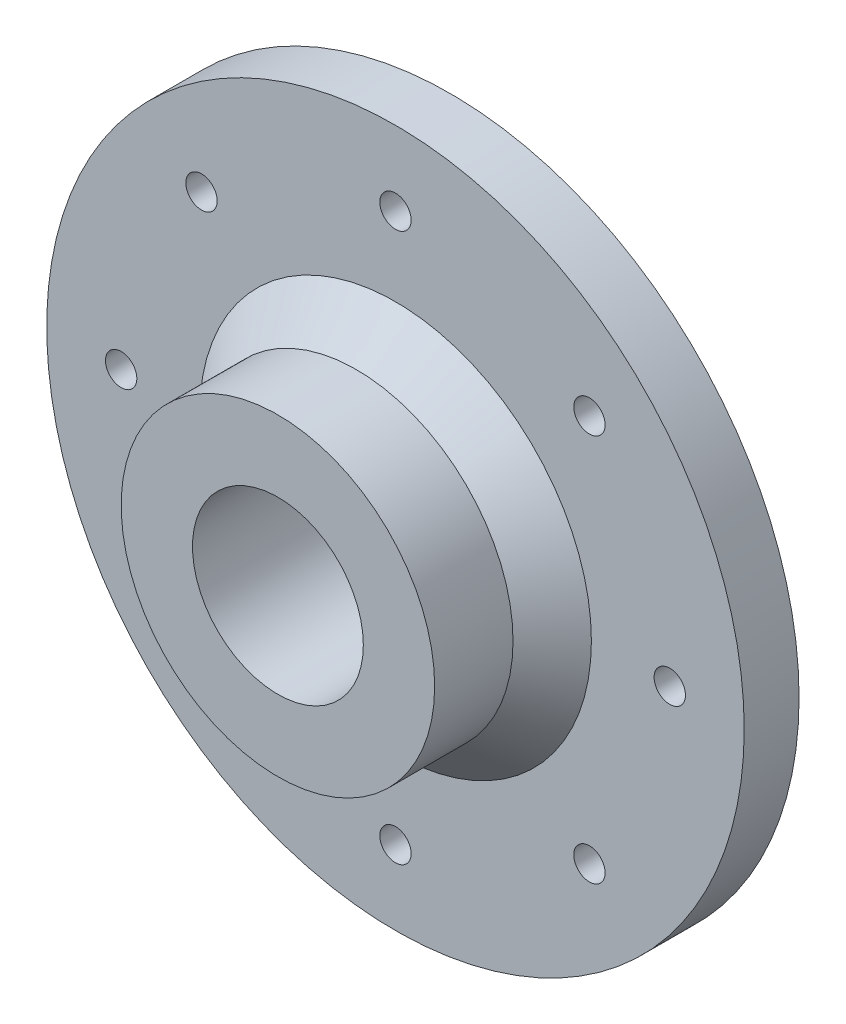
ISO-10303-21;
HEADER;
FILE_DESCRIPTION(('STEP AP214'),'2;1');
FILE_NAME('part.step','',(''),(''),'','','');
FILE_SCHEMA(('AUTOMOTIVE_DESIGN { 1 0 10303 214 1 1 1 1 }'));
ENDSEC;
DATA;
#1=APPLICATION_CONTEXT('core data for automotive mechanical design processes');
#2=APPLICATION_PROTOCOL_DEFINITION('international standard','automotive_design',2000,#1);
#3=PRODUCT_CONTEXT('',#1,'mechanical');
#4=PRODUCT('Part','Part','',(#3));
#5=PRODUCT_RELATED_PRODUCT_CATEGORY('part','',(#4));
#6=PRODUCT_DEFINITION_FORMATION('','',#4);
#7=PRODUCT_DEFINITION_CONTEXT('part definition',#1,'design');
#8=PRODUCT_DEFINITION('design','',#6,#7);
#9=PRODUCT_DEFINITION_SHAPE('','',#8);
#10=(LENGTH_UNIT() NAMED_UNIT(*) SI_UNIT(.MILLI.,.METRE.));
#11=(NAMED_UNIT(*) PLANE_ANGLE_UNIT() SI_UNIT($,.RADIAN.));
#12=(NAMED_UNIT(*) SI_UNIT($,.STERADIAN.) SOLID_ANGLE_UNIT());
#13=UNCERTAINTY_MEASURE_WITH_UNIT(LENGTH_MEASURE(1.E-05),#10,'distance_accuracy_value','');
#14=(GEOMETRIC_REPRESENTATION_CONTEXT(3) GLOBAL_UNCERTAINTY_ASSIGNED_CONTEXT((#13)) GLOBAL_UNIT_ASSIGNED_CONTEXT((#10,
#11,#12)) REPRESENTATION_CONTEXT('',''));
#15=CARTESIAN_POINT('',(0.,0.,0.));
#16=DIRECTION('',(0.,0.,1.));
#17=DIRECTION('',(1.,0.,0.));
#18=AXIS2_PLACEMENT_3D('',#15,#16,#17);
#19=CARTESIAN_POINT('',(0.,0.,7.));
#20=DIRECTION('',(0.,0.,1.));
#21=DIRECTION('',(1.,0.,0.));
#22=AXIS2_PLACEMENT_3D('',#19,#20,#21);
#23=PLANE('',#22);
#24=CARTESIAN_POINT('',(0.,0.,7.));
#25=DIRECTION('',(0.,0.,1.));
#26=DIRECTION('',(1.,0.,0.));
#27=AXIS2_PLACEMENT_3D('',#24,#25,#26);
#28=CIRCLE('',#27,25.);
#29=CARTESIAN_POINT('',(25.,0.,7.));
#30=VERTEX_POINT('',#29);
#31=EDGE_CURVE('E10',#30,#30,#28,.F.);
#32=ORIENTED_EDGE('',*,*,#31,.T.);
#33=EDGE_LOOP('',(#32));
#34=FACE_BOUND('',#33,.T.);
#35=CARTESIAN_POINT('',(-24.7487373415292,24.7487373415292,7.));
#36=DIRECTION('',(0.,0.,1.));
#37=DIRECTION('',(1.,0.,0.));
#38=AXIS2_PLACEMENT_3D('',#35,#36,#37);
#39=CIRCLE('',#38,2.);
#40=CARTESIAN_POINT('',(-22.7487373415292,24.7487373415292,7.));
#41=VERTEX_POINT('',#40);
#42=EDGE_CURVE('E102',#41,#41,#39,.T.);
#43=ORIENTED_EDGE('',*,*,#42,.F.);
#44=EDGE_LOOP('',(#43));
#45=FACE_BOUND('',#44,.T.);
#46=CARTESIAN_POINT('',(-35.,0.,7.));
#47=DIRECTION('',(0.,0.,1.));
#48=DIRECTION('',(1.,0.,0.));
#49=AXIS2_PLACEMENT_3D('',#46,#47,#48);
#50=CIRCLE('',#49,2.);
#51=CARTESIAN_POINT('',(-33.,0.,7.));
#52=VERTEX_POINT('',#51);
#53=EDGE_CURVE('E96',#52,#52,#50,.T.);
#54=ORIENTED_EDGE('',*,*,#53,.F.);
#55=EDGE_LOOP('',(#54));
#56=FACE_BOUND('',#55,.T.);
#57=CARTESIAN_POINT('',(-24.7487373415292,-24.7487373415292,7.));
#58=DIRECTION('',(0.,0.,1.));
#59=DIRECTION('',(1.,0.,0.));
#60=AXIS2_PLACEMENT_3D('',#57,#58,#59);
#61=CIRCLE('',#60,2.00000000000001);
#62=CARTESIAN_POINT('',(-22.7487373415292,-24.7487373415292,7.));
#63=VERTEX_POINT('',#62);
#64=EDGE_CURVE('E90',#63,#63,#61,.T.);
#65=ORIENTED_EDGE('',*,*,#64,.F.);
#66=EDGE_LOOP('',(#65));
#67=FACE_BOUND('',#66,.T.);
#68=CARTESIAN_POINT('',(0.,-35.,7.));
#69=DIRECTION('',(0.,0.,1.));
#70=DIRECTION('',(1.,0.,0.));
#71=AXIS2_PLACEMENT_3D('',#68,#69,#70);
#72=CIRCLE('',#71,2.);
#73=CARTESIAN_POINT('',(2.00000000000001,-35.,7.));
#74=VERTEX_POINT('',#73);
#75=EDGE_CURVE('E84',#74,#74,#72,.T.);
#76=ORIENTED_EDGE('',*,*,#75,.F.);
#77=EDGE_LOOP('',(#76));
#78=FACE_BOUND('',#77,.T.);
#79=CARTESIAN_POINT('',(24.7487373415292,-24.7487373415292,7.));
#80=DIRECTION('',(0.,0.,1.));
#81=DIRECTION('',(1.,0.,0.));
#82=AXIS2_PLACEMENT_3D('',#79,#80,#81);
#83=CIRCLE('',#82,2.);
#84=CARTESIAN_POINT('',(26.7487373415292,-24.7487373415292,7.));
#85=VERTEX_POINT('',#84);
#86=EDGE_CURVE('E78',#85,#85,#83,.T.);
#87=ORIENTED_EDGE('',*,*,#86,.F.);
#88=EDGE_LOOP('',(#87));
#89=FACE_BOUND('',#88,.T.);
#90=CARTESIAN_POINT('',(35.,0.,7.));
#91=DIRECTION('',(0.,0.,1.));
#92=DIRECTION('',(1.,0.,0.));
#93=AXIS2_PLACEMENT_3D('',#90,#91,#92);
#94=CIRCLE('',#93,2.);
#95=CARTESIAN_POINT('',(37.,0.,7.));
#96=VERTEX_POINT('',#95);
#97=EDGE_CURVE('E72',#96,#96,#94,.T.);
#98=ORIENTED_EDGE('',*,*,#97,.F.);
#99=EDGE_LOOP('',(#98));
#100=FACE_BOUND('',#99,.T.);
#101=CARTESIAN_POINT('',(24.7487373415292,24.7487373415292,7.));
#102=DIRECTION('',(0.,0.,1.));
#103=DIRECTION('',(1.,0.,0.));
#104=AXIS2_PLACEMENT_3D('',#101,#102,#103);
#105=CIRCLE('',#104,2.);
#106=CARTESIAN_POINT('',(26.7487373415292,24.7487373415292,7.));
#107=VERTEX_POINT('',#106);
#108=EDGE_CURVE('E66',#107,#107,#105,.T.);
#109=ORIENTED_EDGE('',*,*,#108,.F.);
#110=EDGE_LOOP('',(#109));
#111=FACE_BOUND('',#110,.T.);
#112=CARTESIAN_POINT('',(0.,35.,7.));
#113=DIRECTION('',(0.,0.,1.));
#114=DIRECTION('',(1.,0.,0.));
#115=AXIS2_PLACEMENT_3D('',#112,#113,#114);
#116=CIRCLE('',#115,2.);
#117=CARTESIAN_POINT('',(2.,35.,7.));
#118=VERTEX_POINT('',#117);
#119=EDGE_CURVE('E60',#118,#118,#116,.T.);
#120=ORIENTED_EDGE('',*,*,#119,.F.);
#121=EDGE_LOOP('',(#120));
#122=FACE_BOUND('',#121,.T.);
#123=CARTESIAN_POINT('',(0.,0.,7.));
#124=DIRECTION('',(0.,0.,1.));
#125=DIRECTION('',(1.,0.,0.));
#126=AXIS2_PLACEMENT_3D('',#123,#124,#125);
#127=CIRCLE('',#126,44.5);
#128=CARTESIAN_POINT('',(44.5,0.,7.));
#129=VERTEX_POINT('',#128);
#130=EDGE_CURVE('E41',#129,#129,#127,.T.);
#131=ORIENTED_EDGE('',*,*,#130,.T.);
#132=EDGE_LOOP('',(#131));
#133=FACE_BOUND('',#132,.T.);
#134=ADVANCED_FACE('F30',(#34,#45,#56,#67,#78,#89,#100,#111,#122,#133),#23,.T.);
#135=CARTESIAN_POINT('',(0.,0.,0.));
#136=DIRECTION('',(0.,0.,1.));
#137=DIRECTION('',(1.,0.,0.));
#138=AXIS2_PLACEMENT_3D('',#135,#136,#137);
#139=PLANE('',#138);
#140=CARTESIAN_POINT('',(-24.7487373415292,24.7487373415292,0.));
#141=DIRECTION('',(0.,0.,1.));
#142=DIRECTION('',(1.,0.,0.));
#143=AXIS2_PLACEMENT_3D('',#140,#141,#142);
#144=CIRCLE('',#143,2.);
#145=CARTESIAN_POINT('',(-22.7487373415292,24.7487373415292,0.));
#146=VERTEX_POINT('',#145);
#147=EDGE_CURVE('E99',#146,#146,#144,.T.);
#148=ORIENTED_EDGE('',*,*,#147,.T.);
#149=EDGE_LOOP('',(#148));
#150=FACE_BOUND('',#149,.T.);
#151=CARTESIAN_POINT('',(-35.,0.,0.));
#152=DIRECTION('',(0.,0.,1.));
#153=DIRECTION('',(1.,0.,0.));
#154=AXIS2_PLACEMENT_3D('',#151,#152,#153);
#155=CIRCLE('',#154,2.);
#156=CARTESIAN_POINT('',(-33.,0.,0.));
#157=VERTEX_POINT('',#156);
#158=EDGE_CURVE('E93',#157,#157,#155,.T.);
#159=ORIENTED_EDGE('',*,*,#158,.T.);
#160=EDGE_LOOP('',(#159));
#161=FACE_BOUND('',#160,.T.);
#162=CARTESIAN_POINT('',(-24.7487373415292,-24.7487373415292,0.));
#163=DIRECTION('',(0.,0.,1.));
#164=DIRECTION('',(1.,0.,0.));
#165=AXIS2_PLACEMENT_3D('',#162,#163,#164);
#166=CIRCLE('',#165,2.00000000000001);
#167=CARTESIAN_POINT('',(-22.7487373415292,-24.7487373415292,0.));
#168=VERTEX_POINT('',#167);
#169=EDGE_CURVE('E87',#168,#168,#166,.T.);
#170=ORIENTED_EDGE('',*,*,#169,.T.);
#171=EDGE_LOOP('',(#170));
#172=FACE_BOUND('',#171,.T.);
#173=CARTESIAN_POINT('',(0.,-35.,0.));
#174=DIRECTION('',(0.,0.,1.));
#175=DIRECTION('',(1.,0.,0.));
#176=AXIS2_PLACEMENT_3D('',#173,#174,#175);
#177=CIRCLE('',#176,2.);
#178=CARTESIAN_POINT('',(2.00000000000001,-35.,0.));
#179=VERTEX_POINT('',#178);
#180=EDGE_CURVE('E81',#179,#179,#177,.T.);
#181=ORIENTED_EDGE('',*,*,#180,.T.);
#182=EDGE_LOOP('',(#181));
#183=FACE_BOUND('',#182,.T.);
#184=CARTESIAN_POINT('',(24.7487373415292,-24.7487373415292,0.));
#185=DIRECTION('',(0.,0.,1.));
#186=DIRECTION('',(1.,0.,0.));
#187=AXIS2_PLACEMENT_3D('',#184,#185,#186);
#188=CIRCLE('',#187,2.);
#189=CARTESIAN_POINT('',(26.7487373415292,-24.7487373415292,0.));
#190=VERTEX_POINT('',#189);
#191=EDGE_CURVE('E75',#190,#190,#188,.T.);
#192=ORIENTED_EDGE('',*,*,#191,.T.);
#193=EDGE_LOOP('',(#192));
#194=FACE_BOUND('',#193,.T.);
#195=CARTESIAN_POINT('',(35.,0.,0.));
#196=DIRECTION('',(0.,0.,1.));
#197=DIRECTION('',(1.,0.,0.));
#198=AXIS2_PLACEMENT_3D('',#195,#196,#197);
#199=CIRCLE('',#198,2.);
#200=CARTESIAN_POINT('',(37.,0.,0.));
#201=VERTEX_POINT('',#200);
#202=EDGE_CURVE('E69',#201,#201,#199,.T.);
#203=ORIENTED_EDGE('',*,*,#202,.T.);
#204=EDGE_LOOP('',(#203));
#205=FACE_BOUND('',#204,.T.);
#206=CARTESIAN_POINT('',(24.7487373415292,24.7487373415292,0.));
#207=DIRECTION('',(0.,0.,1.));
#208=DIRECTION('',(1.,0.,0.));
#209=AXIS2_PLACEMENT_3D('',#206,#207,#208);
#210=CIRCLE('',#209,2.);
#211=CARTESIAN_POINT('',(26.7487373415292,24.7487373415292,0.));
#212=VERTEX_POINT('',#211);
#213=EDGE_CURVE('E63',#212,#212,#210,.T.);
#214=ORIENTED_EDGE('',*,*,#213,.T.);
#215=EDGE_LOOP('',(#214));
#216=FACE_BOUND('',#215,.T.);
#217=CARTESIAN_POINT('',(0.,35.,0.));
#218=DIRECTION('',(0.,0.,1.));
#219=DIRECTION('',(1.,0.,0.));
#220=AXIS2_PLACEMENT_3D('',#217,#218,#219);
#221=CIRCLE('',#220,2.);
#222=CARTESIAN_POINT('',(2.,35.,0.));
#223=VERTEX_POINT('',#222);
#224=EDGE_CURVE('E59',#223,#223,#221,.T.);
#225=ORIENTED_EDGE('',*,*,#224,.T.);
#226=EDGE_LOOP('',(#225));
#227=FACE_BOUND('',#226,.T.);
#228=CARTESIAN_POINT('',(0.,0.,0.));
#229=DIRECTION('',(0.,0.,1.));
#230=DIRECTION('',(1.,0.,0.));
#231=AXIS2_PLACEMENT_3D('',#228,#229,#230);
#232=CIRCLE('',#231,44.5);
#233=CARTESIAN_POINT('',(44.5,0.,0.));
#234=VERTEX_POINT('',#233);
#235=EDGE_CURVE('E45',#234,#234,#232,.T.);
#236=ORIENTED_EDGE('',*,*,#235,.F.);
#237=EDGE_LOOP('',(#236));
#238=FACE_BOUND('',#237,.T.);
#239=CARTESIAN_POINT('',(0.,0.,0.));
#240=DIRECTION('',(0.,0.,1.));
#241=DIRECTION('',(1.,0.,0.));
#242=AXIS2_PLACEMENT_3D('',#239,#240,#241);
#243=CIRCLE('',#242,10.9);
#244=CARTESIAN_POINT('',(10.9,0.,0.));
#245=VERTEX_POINT('',#244);
#246=EDGE_CURVE('E49',#245,#245,#243,.T.);
#247=ORIENTED_EDGE('',*,*,#246,.T.);
#248=EDGE_LOOP('',(#247));
#249=FACE_BOUND('',#248,.T.);
#250=ADVANCED_FACE('F108',(#150,#161,#172,#183,#194,#205,#216,#227,#238,#249),#139,.F.);
#251=CARTESIAN_POINT('',(0.,0.,7.));
#252=DIRECTION('',(0.,0.,-1.));
#253=DIRECTION('',(-1.,0.,0.));
#254=AXIS2_PLACEMENT_3D('',#251,#252,#253);
#255=CYLINDRICAL_SURFACE('',#254,44.5);
#256=ORIENTED_EDGE('',*,*,#130,.F.);
#257=EDGE_LOOP('',(#256));
#258=FACE_BOUND('',#257,.T.);
#259=ORIENTED_EDGE('',*,*,#235,.T.);
#260=EDGE_LOOP('',(#259));
#261=FACE_BOUND('',#260,.T.);
#262=ADVANCED_FACE('F137',(#258,#261),#255,.T.);
#263=CARTESIAN_POINT('',(0.,0.,7.));
#264=DIRECTION('',(0.,0.,-1.));
#265=DIRECTION('',(-1.,0.,0.));
#266=AXIS2_PLACEMENT_3D('',#263,#264,#265);
#267=CYLINDRICAL_SURFACE('',#266,10.9);
#268=ORIENTED_EDGE('',*,*,#246,.F.);
#269=EDGE_LOOP('',(#268));
#270=FACE_BOUND('',#269,.T.);
#271=CARTESIAN_POINT('',(0.,0.,22.));
#272=DIRECTION('',(0.,0.,1.));
#273=DIRECTION('',(1.,0.,0.));
#274=AXIS2_PLACEMENT_3D('',#271,#272,#273);
#275=CIRCLE('',#274,10.9);
#276=CARTESIAN_POINT('',(10.9,0.,22.));
#277=VERTEX_POINT('',#276);
#278=EDGE_CURVE('E56',#277,#277,#275,.T.);
#279=ORIENTED_EDGE('',*,*,#278,.T.);
#280=EDGE_LOOP('',(#279));
#281=FACE_BOUND('',#280,.T.);
#282=ADVANCED_FACE('F140',(#270,#281),#267,.F.);
#283=CARTESIAN_POINT('',(0.,0.,22.));
#284=DIRECTION('',(0.,0.,1.));
#285=DIRECTION('',(1.,0.,0.));
#286=AXIS2_PLACEMENT_3D('',#283,#284,#285);
#287=PLANE('',#286);
#288=CARTESIAN_POINT('',(0.,0.,22.));
#289=DIRECTION('',(0.,0.,1.));
#290=DIRECTION('',(1.,0.,0.));
#291=AXIS2_PLACEMENT_3D('',#288,#289,#290);
#292=CIRCLE('',#291,20.);
#293=CARTESIAN_POINT('',(20.,0.,22.));
#294=VERTEX_POINT('',#293);
#295=EDGE_CURVE('E53',#294,#294,#292,.T.);
#296=ORIENTED_EDGE('',*,*,#295,.T.);
#297=EDGE_LOOP('',(#296));
#298=FACE_BOUND('',#297,.T.);
#299=ORIENTED_EDGE('',*,*,#278,.F.);
#300=EDGE_LOOP('',(#299));
#301=FACE_BOUND('',#300,.T.);
#302=ADVANCED_FACE('F150',(#298,#301),#287,.T.);
#303=CARTESIAN_POINT('',(0.,0.,22.));
#304=DIRECTION('',(0.,0.,-1.));
#305=DIRECTION('',(-1.,0.,0.));
#306=AXIS2_PLACEMENT_3D('',#303,#304,#305);
#307=CYLINDRICAL_SURFACE('',#306,20.);
#308=CARTESIAN_POINT('',(0.,0.,12.));
#309=DIRECTION('',(0.,0.,1.));
#310=DIRECTION('',(1.,0.,0.));
#311=AXIS2_PLACEMENT_3D('',#308,#309,#310);
#312=CIRCLE('',#311,20.);
#313=CARTESIAN_POINT('',(20.,0.,12.));
#314=VERTEX_POINT('',#313);
#315=EDGE_CURVE('E37',#314,#314,#312,.T.);
#316=ORIENTED_EDGE('',*,*,#315,.T.);
#317=EDGE_LOOP('',(#316));
#318=FACE_BOUND('',#317,.T.);
#319=ORIENTED_EDGE('',*,*,#295,.F.);
#320=EDGE_LOOP('',(#319));
#321=FACE_BOUND('',#320,.T.);
#322=ADVANCED_FACE('F155',(#318,#321),#307,.T.);
#323=CARTESIAN_POINT('',(0.,35.,0.));
#324=DIRECTION('',(0.,0.,1.));
#325=DIRECTION('',(1.,0.,0.));
#326=AXIS2_PLACEMENT_3D('',#323,#324,#325);
#327=CYLINDRICAL_SURFACE('',#326,2.);
#328=ORIENTED_EDGE('',*,*,#224,.F.);
#329=EDGE_LOOP('',(#328));
#330=FACE_BOUND('',#329,.T.);
#331=ORIENTED_EDGE('',*,*,#119,.T.);
#332=EDGE_LOOP('',(#331));
#333=FACE_BOUND('',#332,.T.);
#334=ADVANCED_FACE('F161',(#330,#333),#327,.F.);
#335=CARTESIAN_POINT('',(24.7487373415292,24.7487373415292,0.));
#336=DIRECTION('',(0.,0.,1.));
#337=DIRECTION('',(1.,0.,0.));
#338=AXIS2_PLACEMENT_3D('',#335,#336,#337);
#339=CYLINDRICAL_SURFACE('',#338,2.);
#340=ORIENTED_EDGE('',*,*,#213,.F.);
#341=EDGE_LOOP('',(#340));
#342=FACE_BOUND('',#341,.T.);
#343=ORIENTED_EDGE('',*,*,#108,.T.);
#344=EDGE_LOOP('',(#343));
#345=FACE_BOUND('',#344,.T.);
#346=ADVANCED_FACE('F166',(#342,#345),#339,.F.);
#347=CARTESIAN_POINT('',(35.,0.,0.));
#348=DIRECTION('',(0.,0.,1.));
#349=DIRECTION('',(1.,0.,0.));
#350=AXIS2_PLACEMENT_3D('',#347,#348,#349);
#351=CYLINDRICAL_SURFACE('',#350,2.);
#352=ORIENTED_EDGE('',*,*,#202,.F.);
#353=EDGE_LOOP('',(#352));
#354=FACE_BOUND('',#353,.T.);
#355=ORIENTED_EDGE('',*,*,#97,.T.);
#356=EDGE_LOOP('',(#355));
#357=FACE_BOUND('',#356,.T.);
#358=ADVANCED_FACE('F170',(#354,#357),#351,.F.);
#359=CARTESIAN_POINT('',(24.7487373415292,-24.7487373415292,0.));
#360=DIRECTION('',(0.,0.,1.));
#361=DIRECTION('',(1.,0.,0.));
#362=AXIS2_PLACEMENT_3D('',#359,#360,#361);
#363=CYLINDRICAL_SURFACE('',#362,2.);
#364=ORIENTED_EDGE('',*,*,#191,.F.);
#365=EDGE_LOOP('',(#364));
#366=FACE_BOUND('',#365,.T.);
#367=ORIENTED_EDGE('',*,*,#86,.T.);
#368=EDGE_LOOP('',(#367));
#369=FACE_BOUND('',#368,.T.);
#370=ADVANCED_FACE('F174',(#366,#369),#363,.F.);
#371=CARTESIAN_POINT('',(0.,-35.,0.));
#372=DIRECTION('',(0.,0.,1.));
#373=DIRECTION('',(1.,0.,0.));
#374=AXIS2_PLACEMENT_3D('',#371,#372,#373);
#375=CYLINDRICAL_SURFACE('',#374,2.);
#376=ORIENTED_EDGE('',*,*,#180,.F.);
#377=EDGE_LOOP('',(#376));
#378=FACE_BOUND('',#377,.T.);
#379=ORIENTED_EDGE('',*,*,#75,.T.);
#380=EDGE_LOOP('',(#379));
#381=FACE_BOUND('',#380,.T.);
#382=ADVANCED_FACE('F178',(#378,#381),#375,.F.);
#383=CARTESIAN_POINT('',(-24.7487373415292,-24.7487373415292,0.));
#384=DIRECTION('',(0.,0.,1.));
#385=DIRECTION('',(1.,0.,0.));
#386=AXIS2_PLACEMENT_3D('',#383,#384,#385);
#387=CYLINDRICAL_SURFACE('',#386,2.00000000000001);
#388=ORIENTED_EDGE('',*,*,#169,.F.);
#389=EDGE_LOOP('',(#388));
#390=FACE_BOUND('',#389,.T.);
#391=ORIENTED_EDGE('',*,*,#64,.T.);
#392=EDGE_LOOP('',(#391));
#393=FACE_BOUND('',#392,.T.);
#394=ADVANCED_FACE('F182',(#390,#393),#387,.F.);
#395=CARTESIAN_POINT('',(-35.,0.,0.));
#396=DIRECTION('',(0.,0.,1.));
#397=DIRECTION('',(1.,0.,0.));
#398=AXIS2_PLACEMENT_3D('',#395,#396,#397);
#399=CYLINDRICAL_SURFACE('',#398,2.);
#400=ORIENTED_EDGE('',*,*,#158,.F.);
#401=EDGE_LOOP('',(#400));
#402=FACE_BOUND('',#401,.T.);
#403=ORIENTED_EDGE('',*,*,#53,.T.);
#404=EDGE_LOOP('',(#403));
#405=FACE_BOUND('',#404,.T.);
#406=ADVANCED_FACE('F114',(#402,#405),#399,.F.);
#407=CARTESIAN_POINT('',(-24.7487373415292,24.7487373415292,0.));
#408=DIRECTION('',(0.,0.,1.));
#409=DIRECTION('',(1.,0.,0.));
#410=AXIS2_PLACEMENT_3D('',#407,#408,#409);
#411=CYLINDRICAL_SURFACE('',#410,2.);
#412=ORIENTED_EDGE('',*,*,#147,.F.);
#413=EDGE_LOOP('',(#412));
#414=FACE_BOUND('',#413,.T.);
#415=ORIENTED_EDGE('',*,*,#42,.T.);
#416=EDGE_LOOP('',(#415));
#417=FACE_BOUND('',#416,.T.);
#418=ADVANCED_FACE('F111',(#414,#417),#411,.F.);
#419=CARTESIAN_POINT('',(0.,0.,12.));
#420=DIRECTION('',(0.,0.,-1.));
#421=DIRECTION('',(-1.,0.,0.));
#422=AXIS2_PLACEMENT_3D('',#419,#420,#421);
#423=CONICAL_SURFACE('',#422,20.,0.785398163397443);
#424=ORIENTED_EDGE('',*,*,#31,.F.);
#425=EDGE_LOOP('',(#424));
#426=FACE_BOUND('',#425,.T.);
#427=ORIENTED_EDGE('',*,*,#315,.F.);
#428=EDGE_LOOP('',(#427));
#429=FACE_BOUND('',#428,.T.);
#430=ADVANCED_FACE('F32',(#426,#429),#423,.T.);
#431=CLOSED_SHELL('',(#134,#250,#262,#282,#302,#322,#334,#346,#358,#370,#382,#394,#406,#418,#430));
#432=MANIFOLD_SOLID_BREP('B2',#431);
#433=ADVANCED_BREP_SHAPE_REPRESENTATION('',(#18,#432),#14);
#434=SHAPE_DEFINITION_REPRESENTATION(#9,#433);
ENDSEC;
END-ISO-10303-21;
